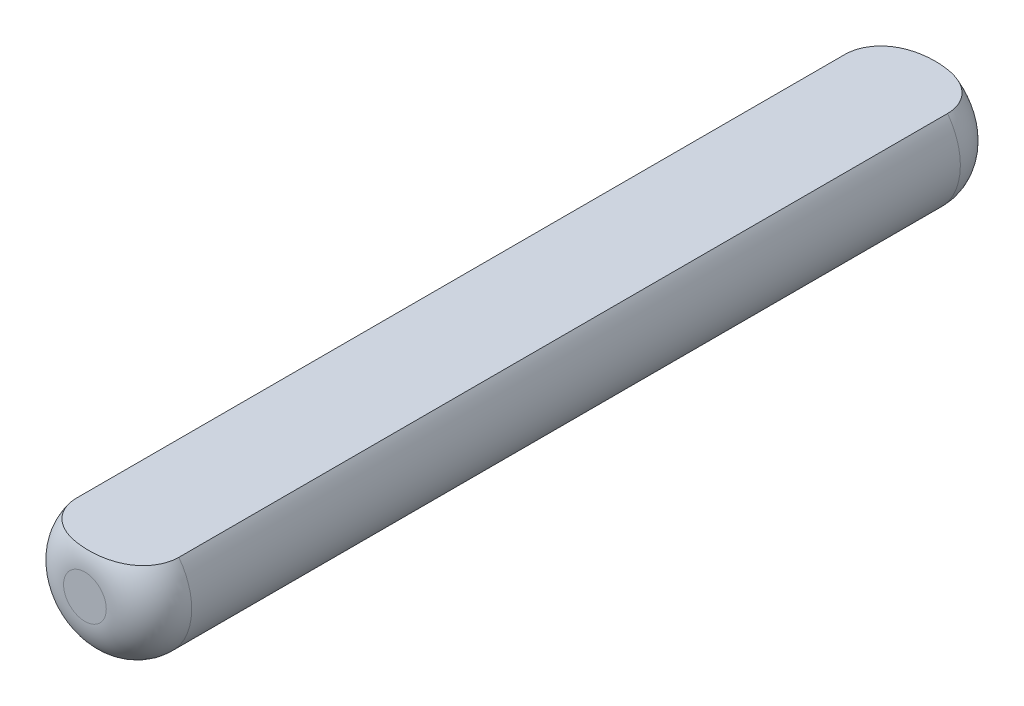
ISO-10303-21;
HEADER;
FILE_DESCRIPTION(('STEP AP214'),'2;1');
FILE_NAME('part.step','',(''),(''),'','','');
FILE_SCHEMA(('AUTOMOTIVE_DESIGN { 1 0 10303 214 1 1 1 1 }'));
ENDSEC;
DATA;
#1=APPLICATION_CONTEXT('core data for automotive mechanical design processes');
#2=APPLICATION_PROTOCOL_DEFINITION('international standard','automotive_design',2000,#1);
#3=PRODUCT_CONTEXT('',#1,'mechanical');
#4=PRODUCT('Part','Part','',(#3));
#5=PRODUCT_RELATED_PRODUCT_CATEGORY('part','',(#4));
#6=PRODUCT_DEFINITION_FORMATION('','',#4);
#7=PRODUCT_DEFINITION_CONTEXT('part definition',#1,'design');
#8=PRODUCT_DEFINITION('design','',#6,#7);
#9=PRODUCT_DEFINITION_SHAPE('','',#8);
#10=(LENGTH_UNIT() NAMED_UNIT(*) SI_UNIT(.MILLI.,.METRE.));
#11=(NAMED_UNIT(*) PLANE_ANGLE_UNIT() SI_UNIT($,.RADIAN.));
#12=(NAMED_UNIT(*) SI_UNIT($,.STERADIAN.) SOLID_ANGLE_UNIT());
#13=UNCERTAINTY_MEASURE_WITH_UNIT(LENGTH_MEASURE(1.E-05),#10,'distance_accuracy_value','');
#14=(GEOMETRIC_REPRESENTATION_CONTEXT(3) GLOBAL_UNCERTAINTY_ASSIGNED_CONTEXT((#13)) GLOBAL_UNIT_ASSIGNED_CONTEXT((#10,
#11,#12)) REPRESENTATION_CONTEXT('',''));
#15=CARTESIAN_POINT('',(0.,0.,0.));
#16=DIRECTION('',(0.,0.,1.));
#17=DIRECTION('',(1.,0.,0.));
#18=AXIS2_PLACEMENT_3D('',#15,#16,#17);
#19=CARTESIAN_POINT('',(0.,0.,40.));
#20=DIRECTION('',(0.,0.,-1.));
#21=DIRECTION('',(-1.,0.,0.));
#22=AXIS2_PLACEMENT_3D('',#19,#20,#21);
#23=CYLINDRICAL_SURFACE('',#22,3.);
#24=CARTESIAN_POINT('',(0.,0.,38.));
#25=DIRECTION('',(0.,0.,1.));
#26=DIRECTION('',(1.,0.,0.));
#27=AXIS2_PLACEMENT_3D('',#24,#25,#26);
#28=CIRCLE('',#27,3.);
#29=CARTESIAN_POINT('',(2.4,1.8,38.));
#30=VERTEX_POINT('',#29);
#31=CARTESIAN_POINT('',(-2.4,1.8,38.));
#32=VERTEX_POINT('',#31);
#33=EDGE_CURVE('E71',#30,#32,#28,.F.);
#34=ORIENTED_EDGE('',*,*,#33,.T.);
#35=DIRECTION('',(0.,0.,-1.));
#36=VECTOR('',#35,1.);
#37=CARTESIAN_POINT('',(-2.4,1.8,40.));
#38=LINE('',#37,#36);
#39=CARTESIAN_POINT('',(-2.4,1.8,2.));
#40=VERTEX_POINT('',#39);
#41=EDGE_CURVE('E54',#32,#40,#38,.T.);
#42=ORIENTED_EDGE('',*,*,#41,.T.);
#43=CARTESIAN_POINT('',(0.,0.,2.));
#44=DIRECTION('',(0.,0.,1.));
#45=DIRECTION('',(1.,0.,0.));
#46=AXIS2_PLACEMENT_3D('',#43,#44,#45);
#47=CIRCLE('',#46,3.);
#48=CARTESIAN_POINT('',(2.4,1.8,2.));
#49=VERTEX_POINT('',#48);
#50=EDGE_CURVE('E73',#40,#49,#47,.T.);
#51=ORIENTED_EDGE('',*,*,#50,.T.);
#52=DIRECTION('',(0.,0.,-1.));
#53=VECTOR('',#52,1.);
#54=CARTESIAN_POINT('',(2.4,1.8,40.));
#55=LINE('',#54,#53);
#56=EDGE_CURVE('E65',#49,#30,#55,.F.);
#57=ORIENTED_EDGE('',*,*,#56,.T.);
#58=EDGE_LOOP('',(#34,#42,#51,#57));
#59=FACE_BOUND('',#58,.T.);
#60=ADVANCED_FACE('F35',(#59),#23,.T.);
#61=CARTESIAN_POINT('',(0.,0.,40.));
#62=DIRECTION('',(0.,0.,1.));
#63=DIRECTION('',(1.,0.,0.));
#64=AXIS2_PLACEMENT_3D('',#61,#62,#63);
#65=PLANE('',#64);
#66=CARTESIAN_POINT('',(0.,0.,40.));
#67=DIRECTION('',(0.,0.,1.));
#68=DIRECTION('',(1.,0.,0.));
#69=AXIS2_PLACEMENT_3D('',#66,#67,#68);
#70=CIRCLE('',#69,1.);
#71=CARTESIAN_POINT('',(1.,0.,40.));
#72=VERTEX_POINT('',#71);
#73=EDGE_CURVE('E48',#72,#72,#70,.T.);
#74=ORIENTED_EDGE('',*,*,#73,.T.);
#75=EDGE_LOOP('',(#74));
#76=FACE_BOUND('',#75,.T.);
#77=ADVANCED_FACE('F89',(#76),#65,.T.);
#78=CARTESIAN_POINT('',(0.,0.,0.));
#79=DIRECTION('',(0.,0.,1.));
#80=DIRECTION('',(1.,0.,0.));
#81=AXIS2_PLACEMENT_3D('',#78,#79,#80);
#82=PLANE('',#81);
#83=CARTESIAN_POINT('',(0.,0.,0.));
#84=DIRECTION('',(0.,0.,1.));
#85=DIRECTION('',(1.,0.,0.));
#86=AXIS2_PLACEMENT_3D('',#83,#84,#85);
#87=CIRCLE('',#86,1.);
#88=CARTESIAN_POINT('',(1.,0.,0.));
#89=VERTEX_POINT('',#88);
#90=EDGE_CURVE('E77',#89,#89,#87,.F.);
#91=ORIENTED_EDGE('',*,*,#90,.T.);
#92=EDGE_LOOP('',(#91));
#93=FACE_BOUND('',#92,.T.);
#94=ADVANCED_FACE('F96',(#93),#82,.F.);
#95=CARTESIAN_POINT('',(0.,0.,2.));
#96=DIRECTION('',(0.,0.,1.));
#97=DIRECTION('',(1.,0.,0.));
#98=AXIS2_PLACEMENT_3D('',#95,#96,#97);
#99=DEGENERATE_TOROIDAL_SURFACE('',#98,1.,2.,.T.);
#100=CARTESIAN_POINT('',(0.,1.8,0.166969722017666));
#101=CARTESIAN_POINT('',(-0.0986785998941134,1.8,0.166975238087045));
#102=CARTESIAN_POINT('',(-0.197346529839382,1.8,0.170477675450817));
#103=CARTESIAN_POINT('',(-0.394209548449965,1.8,0.184913042187482));
#104=CARTESIAN_POINT('',(-0.492404397458323,1.8,0.195849405599045));
#105=CARTESIAN_POINT('',(-0.68720081067676,1.8,0.226181270819594));
#106=CARTESIAN_POINT('',(-0.783806454655332,1.8,0.245549708164188));
#107=CARTESIAN_POINT('',(-0.974465262182511,1.8,0.294071757687691));
#108=CARTESIAN_POINT('',(-1.06852108624494,1.8,0.323214710018872));
#109=CARTESIAN_POINT('',(-1.26583029774225,1.8,0.397560041627408));
#110=CARTESIAN_POINT('',(-1.36845768235951,1.8,0.444470717419789));
#111=CARTESIAN_POINT('',(-1.56509122123428,1.8,0.553888295113033));
#112=CARTESIAN_POINT('',(-1.65910198708867,1.8,0.616386787004061));
#113=CARTESIAN_POINT('',(-1.83552651616728,1.8,0.757508666797526));
#114=CARTESIAN_POINT('',(-1.91784068816743,1.8,0.836257975190657));
#115=CARTESIAN_POINT('',(-2.065979104658,1.8,1.00807150942055));
#116=CARTESIAN_POINT('',(-2.13180888155012,1.8,1.10113091561127));
#117=CARTESIAN_POINT('',(-2.23720083061211,1.8,1.28754255388353));
#118=CARTESIAN_POINT('',(-2.27887474437677,1.8,1.3797028054003));
#119=CARTESIAN_POINT('',(-2.34452577229867,1.8,1.57011541648018));
#120=CARTESIAN_POINT('',(-2.36851347657191,1.8,1.66836409215646));
#121=CARTESIAN_POINT('',(-2.39644764661969,1.8,1.85915363798996));
#122=CARTESIAN_POINT('',(-2.40191765680888,1.8,1.95147438490739));
#123=CARTESIAN_POINT('',(-2.39689553554796,1.8,2.13567111565641));
#124=CARTESIAN_POINT('',(-2.38640678592952,1.8,2.2275471895803));
#125=CARTESIAN_POINT('',(-2.35030117415979,1.8,2.40613408615349));
#126=CARTESIAN_POINT('',(-2.32502501802913,1.8,2.49291427573677));
#127=CARTESIAN_POINT('',(-2.26058356546414,1.8,2.66113019876751));
#128=CARTESIAN_POINT('',(-2.22141882918956,1.8,2.74256614760406));
#129=CARTESIAN_POINT('',(-2.12955683902653,1.8,2.89994959923916));
#130=CARTESIAN_POINT('',(-2.07656511403947,1.8,2.97572467287087));
#131=CARTESIAN_POINT('',(-1.95939791386091,1.8,3.11806122730967));
#132=CARTESIAN_POINT('',(-1.89521774629078,1.8,3.18461882125054));
#133=CARTESIAN_POINT('',(-1.75271671613515,1.8,3.31204250166765));
#134=CARTESIAN_POINT('',(-1.67370313469296,1.8,3.37213038880669));
#135=CARTESIAN_POINT('',(-1.50786459976306,1.8,3.48010981150634));
#136=CARTESIAN_POINT('',(-1.42104320451761,1.8,3.52800686503826));
#137=CARTESIAN_POINT('',(-1.26390306676421,1.8,3.60175998818603));
#138=CARTESIAN_POINT('',(-1.19474255503857,1.8,3.63014162439646));
#139=CARTESIAN_POINT('',(-1.05416593877488,1.8,3.68063819903391));
#140=CARTESIAN_POINT('',(-0.982749379954744,1.8,3.70275186627457));
#141=CARTESIAN_POINT('',(-0.838034036058117,1.8,3.74134266505989));
#142=CARTESIAN_POINT('',(-0.76472741262721,1.8,3.75778998184676));
#143=CARTESIAN_POINT('',(-0.617157947681998,1.8,3.78549164477229));
#144=CARTESIAN_POINT('',(-0.542895096326035,1.8,3.7967459374195));
#145=CARTESIAN_POINT('',(-0.358348827697383,1.8,3.81888706504936));
#146=CARTESIAN_POINT('',(-0.247737219781189,1.8,3.82705178049354));
#147=CARTESIAN_POINT('',(-0.0261563081097727,1.8,3.83445046479966));
#148=CARTESIAN_POINT('',(0.0848132146458739,1.8,3.83367710165681));
#149=CARTESIAN_POINT('',(0.306020069167073,1.8,3.82307860982982));
#150=CARTESIAN_POINT('',(0.416258594625243,1.8,3.8132801259526));
#151=CARTESIAN_POINT('',(0.635242041818319,1.8,3.7833889265005));
#152=CARTESIAN_POINT('',(0.74398862547722,1.8,3.76330881655314));
#153=CARTESIAN_POINT('',(0.970440557346135,1.8,3.70805597598123));
#154=CARTESIAN_POINT('',(1.08781482330207,1.8,3.6714655182648));
#155=CARTESIAN_POINT('',(1.31559913991839,1.8,3.58089149859709));
#156=CARTESIAN_POINT('',(1.42602039299972,1.8,3.52693681748993));
#157=CARTESIAN_POINT('',(1.63698214306462,1.8,3.39965509628724));
#158=CARTESIAN_POINT('',(1.73739712118393,1.8,3.32611638038127));
#159=CARTESIAN_POINT('',(1.92177182460297,1.8,3.16048672940832));
#160=CARTESIAN_POINT('',(2.00573510880869,1.8,3.06839981553315));
#161=CARTESIAN_POINT('',(2.14170378773492,1.8,2.88268700099884));
#162=CARTESIAN_POINT('',(2.19655590053385,1.8,2.7911424114992));
#163=CARTESIAN_POINT('',(2.28775023694629,1.8,2.59927472144413));
#164=CARTESIAN_POINT('',(2.32410951262713,1.8,2.49895980833114));
#165=CARTESIAN_POINT('',(2.37344556135317,1.8,2.30513950926308));
#166=CARTESIAN_POINT('',(2.38864566212387,1.8,2.2121942845736));
#167=CARTESIAN_POINT('',(2.40254652843964,1.8,2.02508558426061));
#168=CARTESIAN_POINT('',(2.40125250179713,1.8,1.93092250254016));
#169=CARTESIAN_POINT('',(2.38259230347494,1.8,1.74786718588304));
#170=CARTESIAN_POINT('',(2.36584296863454,1.8,1.65891112953878));
#171=CARTESIAN_POINT('',(2.3177948786314,1.8,1.48503513443969));
#172=CARTESIAN_POINT('',(2.28649679833613,1.8,1.40011500867296));
#173=CARTESIAN_POINT('',(2.21011098434111,1.8,1.23563696772895));
#174=CARTESIAN_POINT('',(2.16487938683766,1.8,1.15614609480629));
#175=CARTESIAN_POINT('',(2.06239114822016,1.8,1.00536938877244));
#176=CARTESIAN_POINT('',(2.00513292643795,1.8,0.934084636106138));
#177=CARTESIAN_POINT('',(1.87694794583826,1.8,0.797209267821055));
#178=CARTESIAN_POINT('',(1.80542713631104,1.8,0.732176714614894));
#179=CARTESIAN_POINT('',(1.6535258887066,1.8,0.613512927513511));
#180=CARTESIAN_POINT('',(1.57314145111642,1.8,0.559886872774925));
#181=CARTESIAN_POINT('',(1.37120696379265,1.8,0.444290804678226));
#182=CARTESIAN_POINT('',(1.24637956290656,1.8,0.388040119487766));
#183=CARTESIAN_POINT('',(0.989376682558869,1.8,0.296476142840079));
#184=CARTESIAN_POINT('',(0.857190636952698,1.8,0.261193854321601));
#185=CARTESIAN_POINT('',(0.604491105474044,1.8,0.211015292219229));
#186=CARTESIAN_POINT('',(0.484321810099182,1.8,0.194282993609102));
#187=CARTESIAN_POINT('',(0.242764158095312,1.8,0.172246586378911));
#188=CARTESIAN_POINT('',(0.121374007853963,1.8,0.166962937289783));
#189=CARTESIAN_POINT('',(0.,1.8,0.166969722017666));
#190=B_SPLINE_CURVE_WITH_KNOTS('',3,(#100,#101,#102,#103,#104,#105,#106,#107,#108,#109,#110,
#111,#112,#113,#114,#115,#116,#117,#118,#119,#120,#121,#122,#123,#124,#125,#126,#127,#128,#129,
#130,#131,#132,#133,#134,#135,#136,#137,#138,#139,#140,#141,#142,#143,#144,#145,#146,#147,#148,
#149,#150,#151,#152,#153,#154,#155,#156,#157,#158,#159,#160,#161,#162,#163,#164,#165,#166,#167,
#168,#169,#170,#171,#172,#173,#174,#175,#176,#177,#178,#179,#180,#181,#182,#183,#184,#185,#186,
#187,#188,#189),.UNSPECIFIED.,.T.,.F.,(4,2,2,2,2,2,2,2,2,2,2,2,2,2,2,2,2,2,2,2,2,2,2,2,2,2,2,2,
2,2,2,2,2,2,2,2,2,2,2,2,2,2,2,2,4),(0.,0.295949653695498,0.592036111796913,0.887179146832613,
1.18200134704731,1.51927976293908,1.85637660099008,2.19619075075287,2.5358907006511,
2.83767550406189,3.13927945824436,3.41537263411145,3.6914073110335,3.96131945882432,
4.2312207216487,4.50742049637946,4.78373638786554,5.0803670815448,5.3768632707044,
5.60083274182996,5.82484760302654,6.05002378312748,6.27520228263474,6.60750999736436,
6.9400903271253,7.2716919184159,7.60288792476429,7.97053125870932,8.33756624716975,
8.70874180895325,9.07983698747111,9.39815717912841,9.71618331622703,9.99731399926407,
10.278355921038,10.5486447906642,10.8189211237476,11.0920873088679,11.3652894189135,
11.6541014321146,11.9430443027048,12.351468674033,12.7604954307166,13.1238626665679,
13.4878787311509),.UNSPECIFIED.);
#191=EDGE_CURVE('E59',#49,#40,#190,.T.);
#192=ORIENTED_EDGE('',*,*,#191,.F.);
#193=ORIENTED_EDGE('',*,*,#50,.F.);
#194=EDGE_LOOP('',(#192,#193));
#195=FACE_BOUND('',#194,.T.);
#196=ORIENTED_EDGE('',*,*,#90,.F.);
#197=EDGE_LOOP('',(#196));
#198=FACE_BOUND('',#197,.T.);
#199=ADVANCED_FACE('F91',(#195,#198),#99,.T.);
#200=CARTESIAN_POINT('',(0.,0.,38.));
#201=DIRECTION('',(0.,0.,1.));
#202=DIRECTION('',(1.,0.,0.));
#203=AXIS2_PLACEMENT_3D('',#200,#201,#202);
#204=DEGENERATE_TOROIDAL_SURFACE('',#203,1.,2.,.T.);
#205=CARTESIAN_POINT('',(0.,1.8,39.8330302779823));
#206=CARTESIAN_POINT('',(0.0986785998941131,1.8,39.833024761913));
#207=CARTESIAN_POINT('',(0.197346529839382,1.8,39.8295223245492));
#208=CARTESIAN_POINT('',(0.394209548449965,1.8,39.8150869578125));
#209=CARTESIAN_POINT('',(0.492404397458322,1.8,39.804150594401));
#210=CARTESIAN_POINT('',(0.68720081067676,1.8,39.7738187291804));
#211=CARTESIAN_POINT('',(0.783806454655331,1.8,39.7544502918358));
#212=CARTESIAN_POINT('',(0.97446526218251,1.8,39.7059282423123));
#213=CARTESIAN_POINT('',(1.06852108624494,1.8,39.6767852899811));
#214=CARTESIAN_POINT('',(1.26583029774225,1.8,39.6024399583726));
#215=CARTESIAN_POINT('',(1.36845768235951,1.8,39.5555292825802));
#216=CARTESIAN_POINT('',(1.56509122123427,1.8,39.446111704887));
#217=CARTESIAN_POINT('',(1.65910198708867,1.8,39.3836132129959));
#218=CARTESIAN_POINT('',(1.83552651616728,1.8,39.2424913332025));
#219=CARTESIAN_POINT('',(1.91784068816743,1.8,39.1637420248093));
#220=CARTESIAN_POINT('',(2.065979104658,1.8,38.9919284905794));
#221=CARTESIAN_POINT('',(2.13180888155012,1.8,38.8988690843887));
#222=CARTESIAN_POINT('',(2.23720083061211,1.8,38.7124574461165));
#223=CARTESIAN_POINT('',(2.27887474437677,1.8,38.6202971945997));
#224=CARTESIAN_POINT('',(2.34452577229867,1.8,38.4298845835198));
#225=CARTESIAN_POINT('',(2.36851347657191,1.8,38.3316359078435));
#226=CARTESIAN_POINT('',(2.39644764661969,1.8,38.14084636201));
#227=CARTESIAN_POINT('',(2.40191765680888,1.8,38.0485256150926));
#228=CARTESIAN_POINT('',(2.39689553554796,1.8,37.8643288843436));
#229=CARTESIAN_POINT('',(2.38640678592952,1.8,37.7724528104197));
#230=CARTESIAN_POINT('',(2.3503011741598,1.8,37.5938659138465));
#231=CARTESIAN_POINT('',(2.32502501802914,1.8,37.5070857242632));
#232=CARTESIAN_POINT('',(2.26058356546414,1.8,37.3388698012325));
#233=CARTESIAN_POINT('',(2.22141882918956,1.8,37.2574338523959));
#234=CARTESIAN_POINT('',(2.12955683902653,1.8,37.1000504007608));
#235=CARTESIAN_POINT('',(2.07656511403948,1.8,37.0242753271291));
#236=CARTESIAN_POINT('',(1.95939791386091,1.8,36.8819387726903));
#237=CARTESIAN_POINT('',(1.89521774629079,1.8,36.8153811787495));
#238=CARTESIAN_POINT('',(1.75271671613516,1.8,36.6879574983323));
#239=CARTESIAN_POINT('',(1.67370313469296,1.8,36.6278696111933));
#240=CARTESIAN_POINT('',(1.50786459976306,1.8,36.5198901884937));
#241=CARTESIAN_POINT('',(1.42104320451762,1.8,36.4719931349617));
#242=CARTESIAN_POINT('',(1.26390306676422,1.8,36.398240011814));
#243=CARTESIAN_POINT('',(1.19474255503857,1.8,36.3698583756035));
#244=CARTESIAN_POINT('',(1.05416593877489,1.8,36.3193618009661));
#245=CARTESIAN_POINT('',(0.982749379954751,1.8,36.2972481337254));
#246=CARTESIAN_POINT('',(0.838034036058125,1.8,36.2586573349401));
#247=CARTESIAN_POINT('',(0.764727412627219,1.8,36.2422100181532));
#248=CARTESIAN_POINT('',(0.617157947682008,1.8,36.2145083552277));
#249=CARTESIAN_POINT('',(0.542895096326046,1.8,36.2032540625805));
#250=CARTESIAN_POINT('',(0.358348827697395,1.8,36.1811129349506));
#251=CARTESIAN_POINT('',(0.247737219781202,1.8,36.1729482195065));
#252=CARTESIAN_POINT('',(0.0261563081097856,1.8,36.1655495352003));
#253=CARTESIAN_POINT('',(-0.0848132146458611,1.8,36.1663228983432));
#254=CARTESIAN_POINT('',(-0.306020069167061,1.8,36.1769213901702));
#255=CARTESIAN_POINT('',(-0.416258594625231,1.8,36.1867198740474));
#256=CARTESIAN_POINT('',(-0.635242041818308,1.8,36.2166110734995));
#257=CARTESIAN_POINT('',(-0.743988625477209,1.8,36.2366911834469));
#258=CARTESIAN_POINT('',(-0.970440557346125,1.8,36.2919440240188));
#259=CARTESIAN_POINT('',(-1.08781482330206,1.8,36.3285344817352));
#260=CARTESIAN_POINT('',(-1.31559913991838,1.8,36.4191085014029));
#261=CARTESIAN_POINT('',(-1.42602039299971,1.8,36.4730631825101));
#262=CARTESIAN_POINT('',(-1.63698214306462,1.8,36.6003449037128));
#263=CARTESIAN_POINT('',(-1.73739712118392,1.8,36.6738836196187));
#264=CARTESIAN_POINT('',(-1.92177182460297,1.8,36.8395132705917));
#265=CARTESIAN_POINT('',(-2.00573510880869,1.8,36.9316001844668));
#266=CARTESIAN_POINT('',(-2.14170378773492,1.8,37.1173129990012));
#267=CARTESIAN_POINT('',(-2.19655590053385,1.8,37.2088575885008));
#268=CARTESIAN_POINT('',(-2.28775023694629,1.8,37.4007252785559));
#269=CARTESIAN_POINT('',(-2.32410951262713,1.8,37.5010401916689));
#270=CARTESIAN_POINT('',(-2.37344556135317,1.8,37.6948604907369));
#271=CARTESIAN_POINT('',(-2.38864566212387,1.8,37.7878057154264));
#272=CARTESIAN_POINT('',(-2.40254652843964,1.8,37.9749144157394));
#273=CARTESIAN_POINT('',(-2.40125250179713,1.8,38.0690774974598));
#274=CARTESIAN_POINT('',(-2.38259230347494,1.8,38.252132814117));
#275=CARTESIAN_POINT('',(-2.36584296863454,1.8,38.3410888704612));
#276=CARTESIAN_POINT('',(-2.3177948786314,1.8,38.5149648655603));
#277=CARTESIAN_POINT('',(-2.28649679833613,1.8,38.5998849913271));
#278=CARTESIAN_POINT('',(-2.21011098434111,1.8,38.764363032271));
#279=CARTESIAN_POINT('',(-2.16487938683766,1.8,38.8438539051937));
#280=CARTESIAN_POINT('',(-2.06239114822016,1.8,38.9946306112276));
#281=CARTESIAN_POINT('',(-2.00513292643795,1.8,39.0659153638939));
#282=CARTESIAN_POINT('',(-1.87694794583827,1.8,39.2027907321789));
#283=CARTESIAN_POINT('',(-1.80542713631105,1.8,39.2678232853851));
#284=CARTESIAN_POINT('',(-1.65352588870661,1.8,39.3864870724865));
#285=CARTESIAN_POINT('',(-1.57314145111642,1.8,39.4401131272251));
#286=CARTESIAN_POINT('',(-1.37120696379266,1.8,39.5557091953218));
#287=CARTESIAN_POINT('',(-1.24637956290657,1.8,39.6119598805122));
#288=CARTESIAN_POINT('',(-0.989376682558881,1.8,39.7035238571599));
#289=CARTESIAN_POINT('',(-0.85719063695271,1.8,39.7388061456784));
#290=CARTESIAN_POINT('',(-0.604491105474054,1.8,39.7889847077808));
#291=CARTESIAN_POINT('',(-0.484321810099191,1.8,39.8057170063909));
#292=CARTESIAN_POINT('',(-0.242764158095317,1.8,39.8277534136211));
#293=CARTESIAN_POINT('',(-0.121374007853965,1.8,39.8330370627102));
#294=CARTESIAN_POINT('',(0.,1.8,39.8330302779823));
#295=B_SPLINE_CURVE_WITH_KNOTS('',3,(#205,#206,#207,#208,#209,#210,#211,#212,#213,#214,#215,
#216,#217,#218,#219,#220,#221,#222,#223,#224,#225,#226,#227,#228,#229,#230,#231,#232,#233,#234,
#235,#236,#237,#238,#239,#240,#241,#242,#243,#244,#245,#246,#247,#248,#249,#250,#251,#252,#253,
#254,#255,#256,#257,#258,#259,#260,#261,#262,#263,#264,#265,#266,#267,#268,#269,#270,#271,#272,
#273,#274,#275,#276,#277,#278,#279,#280,#281,#282,#283,#284,#285,#286,#287,#288,#289,#290,#291,
#292,#293,#294),.UNSPECIFIED.,.T.,.F.,(4,2,2,2,2,2,2,2,2,2,2,2,2,2,2,2,2,2,2,2,2,2,2,2,2,2,2,2,
2,2,2,2,2,2,2,2,2,2,2,2,2,2,2,2,4),(0.,0.295949653695498,0.592036111796913,0.887179146832612,
1.1820013470473,1.51927976293907,1.85637660099008,2.19619075075287,2.5358907006511,
2.83767550406189,3.13927945824436,3.41537263411144,3.69140731103349,3.9613194588243,
4.2312207216487,4.50742049637946,4.78373638786554,5.08036708154479,5.37686327070439,
5.60083274182996,5.82484760302652,6.05002378312747,6.27520228263472,6.60750999736435,
6.94009032712528,7.27169191841589,7.60288792476428,7.97053125870931,8.33756624716974,
8.70874180895324,9.0798369874711,9.39815717912841,9.71618331622703,9.99731399926408,
10.278355921038,10.5486447906641,10.8189211237476,11.0920873088679,11.3652894189135,
11.6541014321146,11.9430443027048,12.3514686740329,12.7604954307166,13.1238626665679,
13.4878787311509),.UNSPECIFIED.);
#296=EDGE_CURVE('E11',#32,#30,#295,.T.);
#297=ORIENTED_EDGE('',*,*,#296,.F.);
#298=ORIENTED_EDGE('',*,*,#33,.F.);
#299=EDGE_LOOP('',(#297,#298));
#300=FACE_BOUND('',#299,.T.);
#301=ORIENTED_EDGE('',*,*,#73,.F.);
#302=EDGE_LOOP('',(#301));
#303=FACE_BOUND('',#302,.T.);
#304=ADVANCED_FACE('F37',(#300,#303),#204,.T.);
#305=CARTESIAN_POINT('',(-3.,1.8,0.));
#306=DIRECTION('',(0.,-1.,0.));
#307=DIRECTION('',(0.,0.,-1.));
#308=AXIS2_PLACEMENT_3D('',#305,#306,#307);
#309=PLANE('',#308);
#310=ORIENTED_EDGE('',*,*,#191,.T.);
#311=ORIENTED_EDGE('',*,*,#41,.F.);
#312=ORIENTED_EDGE('',*,*,#296,.T.);
#313=ORIENTED_EDGE('',*,*,#56,.F.);
#314=EDGE_LOOP('',(#310,#311,#312,#313));
#315=FACE_BOUND('',#314,.T.);
#316=ADVANCED_FACE('F64',(#315),#309,.F.);
#317=CLOSED_SHELL('',(#60,#77,#94,#199,#304,#316));
#318=MANIFOLD_SOLID_BREP('B2',#317);
#319=ADVANCED_BREP_SHAPE_REPRESENTATION('',(#18,#318),#14);
#320=SHAPE_DEFINITION_REPRESENTATION(#9,#319);
ENDSEC;
END-ISO-10303-21;
